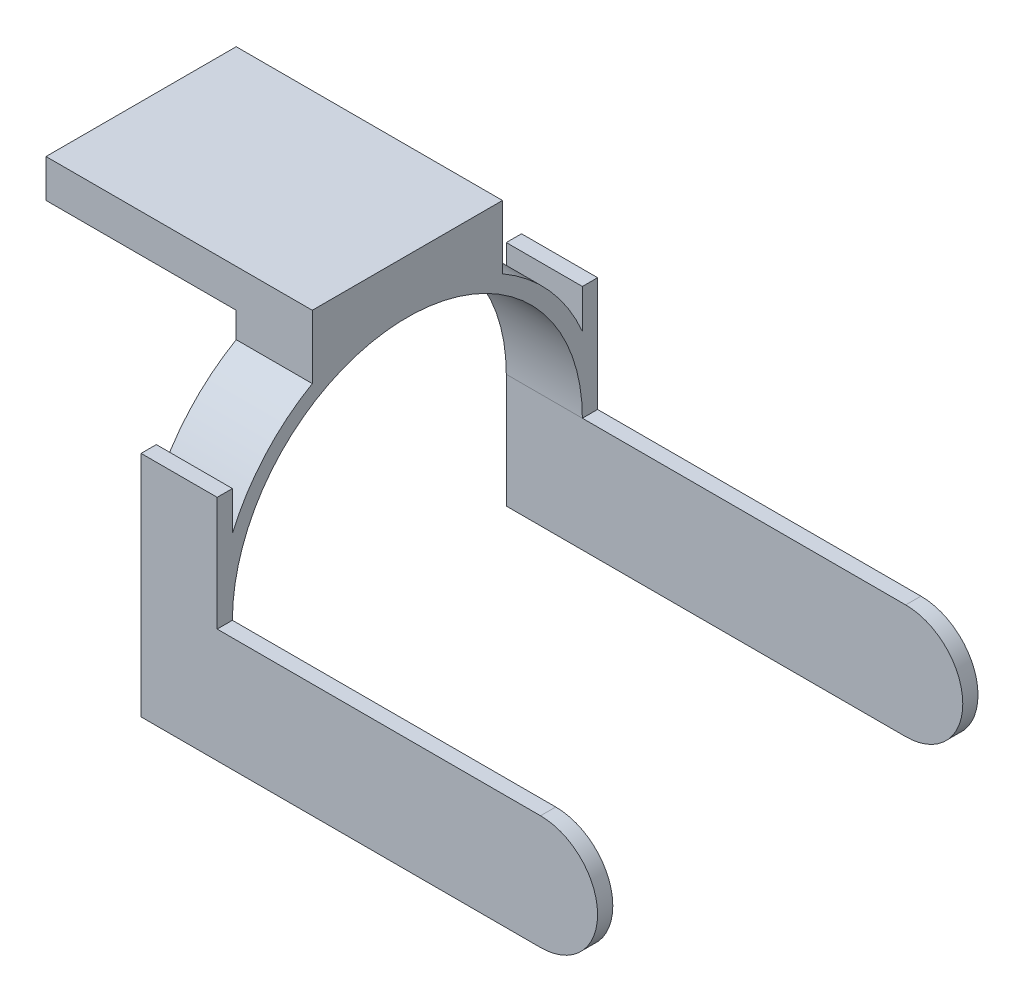
ISO-10303-21;
HEADER;
FILE_DESCRIPTION(('STEP AP214'),'2;1');
FILE_NAME('part.step','',(''),(''),'','','');
FILE_SCHEMA(('AUTOMOTIVE_DESIGN { 1 0 10303 214 1 1 1 1 }'));
ENDSEC;
DATA;
#1=APPLICATION_CONTEXT('core data for automotive mechanical design processes');
#2=APPLICATION_PROTOCOL_DEFINITION('international standard','automotive_design',2000,#1);
#3=PRODUCT_CONTEXT('',#1,'mechanical');
#4=PRODUCT('Part','Part','',(#3));
#5=PRODUCT_RELATED_PRODUCT_CATEGORY('part','',(#4));
#6=PRODUCT_DEFINITION_FORMATION('','',#4);
#7=PRODUCT_DEFINITION_CONTEXT('part definition',#1,'design');
#8=PRODUCT_DEFINITION('design','',#6,#7);
#9=PRODUCT_DEFINITION_SHAPE('','',#8);
#10=(LENGTH_UNIT() NAMED_UNIT(*) SI_UNIT(.MILLI.,.METRE.));
#11=(NAMED_UNIT(*) PLANE_ANGLE_UNIT() SI_UNIT($,.RADIAN.));
#12=(NAMED_UNIT(*) SI_UNIT($,.STERADIAN.) SOLID_ANGLE_UNIT());
#13=UNCERTAINTY_MEASURE_WITH_UNIT(LENGTH_MEASURE(1.E-05),#10,'distance_accuracy_value','');
#14=(GEOMETRIC_REPRESENTATION_CONTEXT(3) GLOBAL_UNCERTAINTY_ASSIGNED_CONTEXT((#13)) GLOBAL_UNIT_ASSIGNED_CONTEXT((#10,
#11,#12)) REPRESENTATION_CONTEXT('',''));
#15=CARTESIAN_POINT('',(0.,0.,0.));
#16=DIRECTION('',(0.,0.,1.));
#17=DIRECTION('',(1.,0.,0.));
#18=AXIS2_PLACEMENT_3D('',#15,#16,#17);
#19=CARTESIAN_POINT('',(0.,-55.0830621590042,0.));
#20=DIRECTION('',(1.,0.,0.));
#21=DIRECTION('',(0.,0.,-1.));
#22=AXIS2_PLACEMENT_3D('',#19,#20,#21);
#23=PLANE('',#22);
#24=DIRECTION('',(0.,0.,1.));
#25=VECTOR('',#24,1.);
#26=CARTESIAN_POINT('',(0.,-5.,-25.));
#27=LINE('',#26,#25);
#28=CARTESIAN_POINT('',(0.,-5.,-25.));
#29=VERTEX_POINT('',#28);
#30=CARTESIAN_POINT('',(0.,-5.,25.));
#31=VERTEX_POINT('',#30);
#32=EDGE_CURVE('E54',#29,#31,#27,.T.);
#33=ORIENTED_EDGE('',*,*,#32,.F.);
#34=DIRECTION('',(0.,1.,0.));
#35=VECTOR('',#34,1.);
#36=CARTESIAN_POINT('',(0.,5.,-25.));
#37=LINE('',#36,#35);
#38=CARTESIAN_POINT('',(0.,-11.6987772179597,-25.));
#39=VERTEX_POINT('',#38);
#40=EDGE_CURVE('E206',#39,#29,#37,.T.);
#41=ORIENTED_EDGE('',*,*,#40,.F.);
#42=CARTESIAN_POINT('',(0.,-55.0830621590042,0.));
#43=DIRECTION('',(1.,0.,0.));
#44=DIRECTION('',(0.,0.,-1.));
#45=AXIS2_PLACEMENT_3D('',#42,#43,#44);
#46=CIRCLE('',#45,50.0719100878501);
#47=CARTESIAN_POINT('',(0.,-35.304382227175,-46.));
#48=VERTEX_POINT('',#47);
#49=EDGE_CURVE('E298',#48,#39,#46,.T.);
#50=ORIENTED_EDGE('',*,*,#49,.F.);
#51=DIRECTION('',(0.,-1.,0.));
#52=VECTOR('',#51,1.);
#53=CARTESIAN_POINT('',(0.,-25.0830621590042,-46.));
#54=LINE('',#53,#52);
#55=CARTESIAN_POINT('',(0.,-25.0830621590042,-46.));
#56=VERTEX_POINT('',#55);
#57=EDGE_CURVE('E296',#56,#48,#54,.T.);
#58=ORIENTED_EDGE('',*,*,#57,.F.);
#59=DIRECTION('',(0.,0.,1.));
#60=VECTOR('',#59,1.);
#61=CARTESIAN_POINT('',(0.,-25.0830621590042,-46.));
#62=LINE('',#61,#60);
#63=CARTESIAN_POINT('',(0.,-25.0830621590042,-50.));
#64=VERTEX_POINT('',#63);
#65=EDGE_CURVE('E294',#64,#56,#62,.T.);
#66=ORIENTED_EDGE('',*,*,#65,.F.);
#67=DIRECTION('',(0.,1.,0.));
#68=VECTOR('',#67,1.);
#69=CARTESIAN_POINT('',(0.,-25.0830621590042,-50.));
#70=LINE('',#69,#68);
#71=CARTESIAN_POINT('',(0.,-85.0830621590042,-50.));
#72=VERTEX_POINT('',#71);
#73=EDGE_CURVE('E292',#72,#64,#70,.T.);
#74=ORIENTED_EDGE('',*,*,#73,.F.);
#75=DIRECTION('',(0.,0.,-1.));
#76=VECTOR('',#75,1.);
#77=CARTESIAN_POINT('',(0.,-85.0830621590043,-46.));
#78=LINE('',#77,#76);
#79=CARTESIAN_POINT('',(0.,-85.0830621590043,-46.));
#80=VERTEX_POINT('',#79);
#81=EDGE_CURVE('E289',#80,#72,#78,.T.);
#82=ORIENTED_EDGE('',*,*,#81,.F.);
#83=DIRECTION('',(0.,-1.,0.));
#84=VECTOR('',#83,1.);
#85=CARTESIAN_POINT('',(0.,-55.0830621590042,-46.));
#86=LINE('',#85,#84);
#87=CARTESIAN_POINT('',(0.,-55.0830621590042,-46.));
#88=VERTEX_POINT('',#87);
#89=EDGE_CURVE('E286',#88,#80,#86,.T.);
#90=ORIENTED_EDGE('',*,*,#89,.F.);
#91=CARTESIAN_POINT('',(0.,-55.0830621590042,0.));
#92=DIRECTION('',(-1.,0.,0.));
#93=DIRECTION('',(0.,0.,-1.));
#94=AXIS2_PLACEMENT_3D('',#91,#92,#93);
#95=CIRCLE('',#94,46.);
#96=CARTESIAN_POINT('',(0.,-55.0830621590042,46.));
#97=VERTEX_POINT('',#96);
#98=EDGE_CURVE('E284',#97,#88,#95,.T.);
#99=ORIENTED_EDGE('',*,*,#98,.F.);
#100=DIRECTION('',(0.,1.,0.));
#101=VECTOR('',#100,1.);
#102=CARTESIAN_POINT('',(0.,-55.0830621590042,46.));
#103=LINE('',#102,#101);
#104=CARTESIAN_POINT('',(0.,-85.0830621590042,46.));
#105=VERTEX_POINT('',#104);
#106=EDGE_CURVE('E282',#105,#97,#103,.T.);
#107=ORIENTED_EDGE('',*,*,#106,.F.);
#108=DIRECTION('',(0.,0.,-1.));
#109=VECTOR('',#108,1.);
#110=CARTESIAN_POINT('',(0.,-85.0830621590042,50.));
#111=LINE('',#110,#109);
#112=CARTESIAN_POINT('',(0.,-85.0830621590042,50.));
#113=VERTEX_POINT('',#112);
#114=EDGE_CURVE('E279',#113,#105,#111,.T.);
#115=ORIENTED_EDGE('',*,*,#114,.F.);
#116=DIRECTION('',(0.,-1.,0.));
#117=VECTOR('',#116,1.);
#118=CARTESIAN_POINT('',(0.,-25.0830621590042,50.));
#119=LINE('',#118,#117);
#120=CARTESIAN_POINT('',(0.,-25.0830621590042,50.));
#121=VERTEX_POINT('',#120);
#122=EDGE_CURVE('E276',#121,#113,#119,.T.);
#123=ORIENTED_EDGE('',*,*,#122,.F.);
#124=DIRECTION('',(0.,0.,1.));
#125=VECTOR('',#124,1.);
#126=CARTESIAN_POINT('',(0.,-25.0830621590042,50.));
#127=LINE('',#126,#125);
#128=CARTESIAN_POINT('',(0.,-25.0830621590042,46.));
#129=VERTEX_POINT('',#128);
#130=EDGE_CURVE('E274',#129,#121,#127,.T.);
#131=ORIENTED_EDGE('',*,*,#130,.F.);
#132=DIRECTION('',(0.,1.,0.));
#133=VECTOR('',#132,1.);
#134=CARTESIAN_POINT('',(0.,-25.0830621590042,46.));
#135=LINE('',#134,#133);
#136=CARTESIAN_POINT('',(0.,-35.304382227175,46.));
#137=VERTEX_POINT('',#136);
#138=EDGE_CURVE('E272',#137,#129,#135,.T.);
#139=ORIENTED_EDGE('',*,*,#138,.F.);
#140=CARTESIAN_POINT('',(0.,-55.0830621590042,0.));
#141=DIRECTION('',(1.,0.,0.));
#142=DIRECTION('',(0.,0.,-1.));
#143=AXIS2_PLACEMENT_3D('',#140,#141,#142);
#144=CIRCLE('',#143,50.0719100878501);
#145=CARTESIAN_POINT('',(0.,-11.6987772179597,25.));
#146=VERTEX_POINT('',#145);
#147=EDGE_CURVE('E270',#146,#137,#144,.T.);
#148=ORIENTED_EDGE('',*,*,#147,.F.);
#149=DIRECTION('',(0.,-1.,0.));
#150=VECTOR('',#149,1.);
#151=CARTESIAN_POINT('',(0.,-5.,25.));
#152=LINE('',#151,#150);
#153=EDGE_CURVE('E241',#31,#146,#152,.T.);
#154=ORIENTED_EDGE('',*,*,#153,.F.);
#155=EDGE_LOOP('',(#33,#41,#50,#58,#66,#74,#82,#90,#99,#107,#115,#123,#131,#139,#148,#154));
#156=FACE_BOUND('',#155,.T.);
#157=ADVANCED_FACE('F39',(#156),#23,.F.);
#158=CARTESIAN_POINT('',(20.,-85.0830621590042,50.));
#159=DIRECTION('',(0.,1.,0.));
#160=DIRECTION('',(0.,0.,1.));
#161=AXIS2_PLACEMENT_3D('',#158,#159,#160);
#162=PLANE('',#161);
#163=DIRECTION('',(0.,0.,1.));
#164=VECTOR('',#163,1.);
#165=CARTESIAN_POINT('',(105.,-85.0830621590042,-50.));
#166=LINE('',#165,#164);
#167=CARTESIAN_POINT('',(105.,-85.0830621590042,46.));
#168=VERTEX_POINT('',#167);
#169=CARTESIAN_POINT('',(105.,-85.0830621590042,50.));
#170=VERTEX_POINT('',#169);
#171=EDGE_CURVE('E215',#168,#170,#166,.T.);
#172=ORIENTED_EDGE('',*,*,#171,.T.);
#173=DIRECTION('',(-1.,0.,0.));
#174=VECTOR('',#173,1.);
#175=CARTESIAN_POINT('',(20.,-85.0830621590042,50.));
#176=LINE('',#175,#174);
#177=EDGE_CURVE('E328',#170,#113,#176,.T.);
#178=ORIENTED_EDGE('',*,*,#177,.T.);
#179=ORIENTED_EDGE('',*,*,#114,.T.);
#180=DIRECTION('',(-1.,0.,0.));
#181=VECTOR('',#180,1.);
#182=CARTESIAN_POINT('',(20.,-85.0830621590042,46.));
#183=LINE('',#182,#181);
#184=EDGE_CURVE('E326',#168,#105,#183,.T.);
#185=ORIENTED_EDGE('',*,*,#184,.F.);
#186=EDGE_LOOP('',(#172,#178,#179,#185));
#187=FACE_BOUND('',#186,.T.);
#188=ADVANCED_FACE('F413',(#187),#162,.F.);
#189=CARTESIAN_POINT('',(20.,-85.0830621590043,-46.));
#190=DIRECTION('',(0.,1.,0.));
#191=DIRECTION('',(0.,0.,1.));
#192=AXIS2_PLACEMENT_3D('',#189,#190,#191);
#193=PLANE('',#192);
#194=CARTESIAN_POINT('',(105.,-85.0830621590042,-50.));
#195=VERTEX_POINT('',#194);
#196=CARTESIAN_POINT('',(105.,-85.0830621590042,-46.));
#197=VERTEX_POINT('',#196);
#198=EDGE_CURVE('E222',#195,#197,#166,.T.);
#199=ORIENTED_EDGE('',*,*,#198,.T.);
#200=DIRECTION('',(-1.,0.,0.));
#201=VECTOR('',#200,1.);
#202=CARTESIAN_POINT('',(20.,-85.0830621590043,-46.));
#203=LINE('',#202,#201);
#204=EDGE_CURVE('E318',#197,#80,#203,.T.);
#205=ORIENTED_EDGE('',*,*,#204,.T.);
#206=ORIENTED_EDGE('',*,*,#81,.T.);
#207=DIRECTION('',(-1.,0.,0.));
#208=VECTOR('',#207,1.);
#209=CARTESIAN_POINT('',(20.,-85.0830621590042,-50.));
#210=LINE('',#209,#208);
#211=EDGE_CURVE('E316',#195,#72,#210,.T.);
#212=ORIENTED_EDGE('',*,*,#211,.F.);
#213=EDGE_LOOP('',(#199,#205,#206,#212));
#214=FACE_BOUND('',#213,.T.);
#215=ADVANCED_FACE('F420',(#214),#193,.F.);
#216=CARTESIAN_POINT('',(20.,-55.0830621590042,0.));
#217=DIRECTION('',(1.,0.,0.));
#218=DIRECTION('',(0.,0.,-1.));
#219=AXIS2_PLACEMENT_3D('',#216,#217,#218);
#220=PLANE('',#219);
#221=CARTESIAN_POINT('',(20.,-55.0830621590042,0.));
#222=DIRECTION('',(-1.,0.,0.));
#223=DIRECTION('',(0.,0.,-1.));
#224=AXIS2_PLACEMENT_3D('',#221,#222,#223);
#225=CIRCLE('',#224,46.);
#226=CARTESIAN_POINT('',(20.,-55.0830621590042,46.));
#227=VERTEX_POINT('',#226);
#228=CARTESIAN_POINT('',(20.,-55.0830621590042,-46.));
#229=VERTEX_POINT('',#228);
#230=EDGE_CURVE('E253',#227,#229,#225,.T.);
#231=ORIENTED_EDGE('',*,*,#230,.T.);
#232=DIRECTION('',(0.,0.,1.));
#233=VECTOR('',#232,1.);
#234=CARTESIAN_POINT('',(20.,-55.0830621590042,-46.));
#235=LINE('',#234,#233);
#236=CARTESIAN_POINT('',(20.,-55.0830621590042,-50.));
#237=VERTEX_POINT('',#236);
#238=EDGE_CURVE('E227',#237,#229,#235,.T.);
#239=ORIENTED_EDGE('',*,*,#238,.F.);
#240=DIRECTION('',(0.,1.,0.));
#241=VECTOR('',#240,1.);
#242=CARTESIAN_POINT('',(20.,-25.0830621590042,-50.));
#243=LINE('',#242,#241);
#244=CARTESIAN_POINT('',(20.,-25.0830621590042,-50.));
#245=VERTEX_POINT('',#244);
#246=EDGE_CURVE('E256',#237,#245,#243,.T.);
#247=ORIENTED_EDGE('',*,*,#246,.T.);
#248=DIRECTION('',(0.,0.,1.));
#249=VECTOR('',#248,1.);
#250=CARTESIAN_POINT('',(20.,-25.0830621590042,-46.));
#251=LINE('',#250,#249);
#252=CARTESIAN_POINT('',(20.,-25.0830621590042,-46.));
#253=VERTEX_POINT('',#252);
#254=EDGE_CURVE('E258',#245,#253,#251,.T.);
#255=ORIENTED_EDGE('',*,*,#254,.T.);
#256=DIRECTION('',(0.,-1.,0.));
#257=VECTOR('',#256,1.);
#258=CARTESIAN_POINT('',(20.,-25.0830621590042,-46.));
#259=LINE('',#258,#257);
#260=CARTESIAN_POINT('',(20.,-35.304382227175,-46.));
#261=VERTEX_POINT('',#260);
#262=EDGE_CURVE('E260',#253,#261,#259,.T.);
#263=ORIENTED_EDGE('',*,*,#262,.T.);
#264=CARTESIAN_POINT('',(20.,-55.0830621590042,0.));
#265=DIRECTION('',(1.,0.,0.));
#266=DIRECTION('',(0.,0.,-1.));
#267=AXIS2_PLACEMENT_3D('',#264,#265,#266);
#268=CIRCLE('',#267,50.0719100878501);
#269=CARTESIAN_POINT('',(20.,-11.6987772179597,-25.));
#270=VERTEX_POINT('',#269);
#271=EDGE_CURVE('E262',#261,#270,#268,.T.);
#272=ORIENTED_EDGE('',*,*,#271,.T.);
#273=DIRECTION('',(0.,1.,0.));
#274=VECTOR('',#273,1.);
#275=CARTESIAN_POINT('',(20.,-5.,-25.));
#276=LINE('',#275,#274);
#277=CARTESIAN_POINT('',(20.,5.,-25.));
#278=VERTEX_POINT('',#277);
#279=EDGE_CURVE('E264',#270,#278,#276,.T.);
#280=ORIENTED_EDGE('',*,*,#279,.T.);
#281=DIRECTION('',(0.,0.,1.));
#282=VECTOR('',#281,1.);
#283=CARTESIAN_POINT('',(20.,5.,25.));
#284=LINE('',#283,#282);
#285=CARTESIAN_POINT('',(20.,5.,25.));
#286=VERTEX_POINT('',#285);
#287=EDGE_CURVE('E266',#278,#286,#284,.T.);
#288=ORIENTED_EDGE('',*,*,#287,.T.);
#289=DIRECTION('',(0.,-1.,0.));
#290=VECTOR('',#289,1.);
#291=CARTESIAN_POINT('',(20.,5.,25.));
#292=LINE('',#291,#290);
#293=CARTESIAN_POINT('',(20.,-11.6987772179597,25.));
#294=VERTEX_POINT('',#293);
#295=EDGE_CURVE('E242',#286,#294,#292,.T.);
#296=ORIENTED_EDGE('',*,*,#295,.T.);
#297=CARTESIAN_POINT('',(20.,-55.0830621590042,0.));
#298=DIRECTION('',(1.,0.,0.));
#299=DIRECTION('',(0.,0.,-1.));
#300=AXIS2_PLACEMENT_3D('',#297,#298,#299);
#301=CIRCLE('',#300,50.0719100878501);
#302=CARTESIAN_POINT('',(20.,-35.304382227175,46.));
#303=VERTEX_POINT('',#302);
#304=EDGE_CURVE('E244',#294,#303,#301,.T.);
#305=ORIENTED_EDGE('',*,*,#304,.T.);
#306=DIRECTION('',(0.,1.,0.));
#307=VECTOR('',#306,1.);
#308=CARTESIAN_POINT('',(20.,-25.0830621590042,46.));
#309=LINE('',#308,#307);
#310=CARTESIAN_POINT('',(20.,-25.0830621590042,46.));
#311=VERTEX_POINT('',#310);
#312=EDGE_CURVE('E246',#303,#311,#309,.T.);
#313=ORIENTED_EDGE('',*,*,#312,.T.);
#314=DIRECTION('',(0.,0.,1.));
#315=VECTOR('',#314,1.);
#316=CARTESIAN_POINT('',(20.,-25.0830621590042,50.));
#317=LINE('',#316,#315);
#318=CARTESIAN_POINT('',(20.,-25.0830621590042,50.));
#319=VERTEX_POINT('',#318);
#320=EDGE_CURVE('E248',#311,#319,#317,.T.);
#321=ORIENTED_EDGE('',*,*,#320,.T.);
#322=DIRECTION('',(0.,-1.,0.));
#323=VECTOR('',#322,1.);
#324=CARTESIAN_POINT('',(20.,-25.0830621590042,50.));
#325=LINE('',#324,#323);
#326=CARTESIAN_POINT('',(20.,-55.0830621590042,50.));
#327=VERTEX_POINT('',#326);
#328=EDGE_CURVE('E250',#319,#327,#325,.T.);
#329=ORIENTED_EDGE('',*,*,#328,.T.);
#330=DIRECTION('',(0.,0.,1.));
#331=VECTOR('',#330,1.);
#332=CARTESIAN_POINT('',(20.,-55.0830621590042,50.));
#333=LINE('',#332,#331);
#334=EDGE_CURVE('E234',#227,#327,#333,.T.);
#335=ORIENTED_EDGE('',*,*,#334,.F.);
#336=EDGE_LOOP('',(#231,#239,#247,#255,#263,#272,#280,#288,#296,#305,#313,#321,#329,#335));
#337=FACE_BOUND('',#336,.T.);
#338=ADVANCED_FACE('F359',(#337),#220,.T.);
#339=CARTESIAN_POINT('',(20.,-5.,25.));
#340=DIRECTION('',(0.,0.,-1.));
#341=DIRECTION('',(-1.,0.,0.));
#342=AXIS2_PLACEMENT_3D('',#339,#340,#341);
#343=PLANE('',#342);
#344=DIRECTION('',(-1.,0.,0.));
#345=VECTOR('',#344,1.);
#346=CARTESIAN_POINT('',(20.,5.,25.));
#347=LINE('',#346,#345);
#348=CARTESIAN_POINT('',(-50.,5.,25.));
#349=VERTEX_POINT('',#348);
#350=EDGE_CURVE('E268',#286,#349,#347,.T.);
#351=ORIENTED_EDGE('',*,*,#350,.T.);
#352=DIRECTION('',(0.,1.,0.));
#353=VECTOR('',#352,1.);
#354=CARTESIAN_POINT('',(-50.,5.,25.));
#355=LINE('',#354,#353);
#356=CARTESIAN_POINT('',(-50.,-5.,25.));
#357=VERTEX_POINT('',#356);
#358=EDGE_CURVE('E193',#357,#349,#355,.T.);
#359=ORIENTED_EDGE('',*,*,#358,.F.);
#360=DIRECTION('',(1.,0.,0.));
#361=VECTOR('',#360,1.);
#362=CARTESIAN_POINT('',(-50.,-5.,25.));
#363=LINE('',#362,#361);
#364=EDGE_CURVE('E189',#357,#31,#363,.T.);
#365=ORIENTED_EDGE('',*,*,#364,.T.);
#366=ORIENTED_EDGE('',*,*,#153,.T.);
#367=DIRECTION('',(-1.,0.,0.));
#368=VECTOR('',#367,1.);
#369=CARTESIAN_POINT('',(20.,-11.6987772179597,25.));
#370=LINE('',#369,#368);
#371=EDGE_CURVE('E11',#294,#146,#370,.T.);
#372=ORIENTED_EDGE('',*,*,#371,.F.);
#373=ORIENTED_EDGE('',*,*,#295,.F.);
#374=EDGE_LOOP('',(#351,#359,#365,#366,#372,#373));
#375=FACE_BOUND('',#374,.T.);
#376=ADVANCED_FACE('F41',(#375),#343,.F.);
#377=CARTESIAN_POINT('',(20.,-55.0830621590042,0.));
#378=DIRECTION('',(-1.,0.,0.));
#379=DIRECTION('',(0.,0.,1.));
#380=AXIS2_PLACEMENT_3D('',#377,#378,#379);
#381=CYLINDRICAL_SURFACE('',#380,50.0719100878501);
#382=ORIENTED_EDGE('',*,*,#147,.T.);
#383=DIRECTION('',(-1.,0.,0.));
#384=VECTOR('',#383,1.);
#385=CARTESIAN_POINT('',(20.,-35.304382227175,46.));
#386=LINE('',#385,#384);
#387=EDGE_CURVE('E47',#303,#137,#386,.T.);
#388=ORIENTED_EDGE('',*,*,#387,.F.);
#389=ORIENTED_EDGE('',*,*,#304,.F.);
#390=ORIENTED_EDGE('',*,*,#371,.T.);
#391=EDGE_LOOP('',(#382,#388,#389,#390));
#392=FACE_BOUND('',#391,.T.);
#393=ADVANCED_FACE('F404',(#392),#381,.T.);
#394=CARTESIAN_POINT('',(20.,-25.0830621590042,46.));
#395=DIRECTION('',(0.,0.,1.));
#396=DIRECTION('',(1.,0.,0.));
#397=AXIS2_PLACEMENT_3D('',#394,#395,#396);
#398=PLANE('',#397);
#399=ORIENTED_EDGE('',*,*,#138,.T.);
#400=DIRECTION('',(-1.,0.,0.));
#401=VECTOR('',#400,1.);
#402=CARTESIAN_POINT('',(20.,-25.0830621590042,46.));
#403=LINE('',#402,#401);
#404=EDGE_CURVE('E333',#311,#129,#403,.T.);
#405=ORIENTED_EDGE('',*,*,#404,.F.);
#406=ORIENTED_EDGE('',*,*,#312,.F.);
#407=ORIENTED_EDGE('',*,*,#387,.T.);
#408=EDGE_LOOP('',(#399,#405,#406,#407));
#409=FACE_BOUND('',#408,.T.);
#410=ADVANCED_FACE('F340',(#409),#398,.F.);
#411=CARTESIAN_POINT('',(20.,-25.0830621590042,50.));
#412=DIRECTION('',(0.,-1.,0.));
#413=DIRECTION('',(0.,0.,-1.));
#414=AXIS2_PLACEMENT_3D('',#411,#412,#413);
#415=PLANE('',#414);
#416=ORIENTED_EDGE('',*,*,#130,.T.);
#417=DIRECTION('',(-1.,0.,0.));
#418=VECTOR('',#417,1.);
#419=CARTESIAN_POINT('',(20.,-25.0830621590042,50.));
#420=LINE('',#419,#418);
#421=EDGE_CURVE('E330',#319,#121,#420,.T.);
#422=ORIENTED_EDGE('',*,*,#421,.F.);
#423=ORIENTED_EDGE('',*,*,#320,.F.);
#424=ORIENTED_EDGE('',*,*,#404,.T.);
#425=EDGE_LOOP('',(#416,#422,#423,#424));
#426=FACE_BOUND('',#425,.T.);
#427=ADVANCED_FACE('F350',(#426),#415,.F.);
#428=CARTESIAN_POINT('',(20.,-25.0830621590042,50.));
#429=DIRECTION('',(0.,0.,-1.));
#430=DIRECTION('',(0.,1.,0.));
#431=AXIS2_PLACEMENT_3D('',#428,#429,#430);
#432=PLANE('',#431);
#433=ORIENTED_EDGE('',*,*,#177,.F.);
#434=CARTESIAN_POINT('',(105.,-70.0830621590042,50.));
#435=DIRECTION('',(0.,0.,-1.));
#436=DIRECTION('',(1.,0.,0.));
#437=AXIS2_PLACEMENT_3D('',#434,#435,#436);
#438=CIRCLE('',#437,15.);
#439=CARTESIAN_POINT('',(105.,-55.0830621590042,50.));
#440=VERTEX_POINT('',#439);
#441=EDGE_CURVE('E207',#440,#170,#438,.T.);
#442=ORIENTED_EDGE('',*,*,#441,.F.);
#443=DIRECTION('',(-1.,0.,0.));
#444=VECTOR('',#443,1.);
#445=CARTESIAN_POINT('',(120.,-55.0830621590042,50.));
#446=LINE('',#445,#444);
#447=EDGE_CURVE('E237',#440,#327,#446,.T.);
#448=ORIENTED_EDGE('',*,*,#447,.T.);
#449=ORIENTED_EDGE('',*,*,#328,.F.);
#450=ORIENTED_EDGE('',*,*,#421,.T.);
#451=ORIENTED_EDGE('',*,*,#122,.T.);
#452=EDGE_LOOP('',(#433,#442,#448,#449,#450,#451));
#453=FACE_BOUND('',#452,.T.);
#454=ADVANCED_FACE('F355',(#453),#432,.F.);
#455=CARTESIAN_POINT('',(20.,-55.0830621590042,46.));
#456=DIRECTION('',(0.,0.,1.));
#457=DIRECTION('',(0.,-1.,0.));
#458=AXIS2_PLACEMENT_3D('',#455,#456,#457);
#459=PLANE('',#458);
#460=DIRECTION('',(-1.,0.,0.));
#461=VECTOR('',#460,1.);
#462=CARTESIAN_POINT('',(120.,-55.0830621590042,46.));
#463=LINE('',#462,#461);
#464=CARTESIAN_POINT('',(105.,-55.0830621590042,46.));
#465=VERTEX_POINT('',#464);
#466=EDGE_CURVE('E239',#465,#227,#463,.T.);
#467=ORIENTED_EDGE('',*,*,#466,.F.);
#468=CARTESIAN_POINT('',(105.,-70.0830621590042,46.));
#469=DIRECTION('',(0.,0.,1.));
#470=DIRECTION('',(0.,-1.,0.));
#471=AXIS2_PLACEMENT_3D('',#468,#469,#470);
#472=CIRCLE('',#471,15.);
#473=EDGE_CURVE('E62',#465,#168,#472,.F.);
#474=ORIENTED_EDGE('',*,*,#473,.T.);
#475=ORIENTED_EDGE('',*,*,#184,.T.);
#476=ORIENTED_EDGE('',*,*,#106,.T.);
#477=DIRECTION('',(-1.,0.,0.));
#478=VECTOR('',#477,1.);
#479=CARTESIAN_POINT('',(20.,-55.0830621590042,46.));
#480=LINE('',#479,#478);
#481=EDGE_CURVE('E323',#227,#97,#480,.T.);
#482=ORIENTED_EDGE('',*,*,#481,.F.);
#483=EDGE_LOOP('',(#467,#474,#475,#476,#482));
#484=FACE_BOUND('',#483,.T.);
#485=ADVANCED_FACE('F365',(#484),#459,.F.);
#486=CARTESIAN_POINT('',(20.,-55.0830621590042,0.));
#487=DIRECTION('',(-1.,0.,0.));
#488=DIRECTION('',(0.,0.,1.));
#489=AXIS2_PLACEMENT_3D('',#486,#487,#488);
#490=CYLINDRICAL_SURFACE('',#489,46.);
#491=ORIENTED_EDGE('',*,*,#98,.T.);
#492=DIRECTION('',(-1.,0.,0.));
#493=VECTOR('',#492,1.);
#494=CARTESIAN_POINT('',(20.,-55.0830621590042,-46.));
#495=LINE('',#494,#493);
#496=EDGE_CURVE('E320',#229,#88,#495,.T.);
#497=ORIENTED_EDGE('',*,*,#496,.F.);
#498=ORIENTED_EDGE('',*,*,#230,.F.);
#499=ORIENTED_EDGE('',*,*,#481,.T.);
#500=EDGE_LOOP('',(#491,#497,#498,#499));
#501=FACE_BOUND('',#500,.T.);
#502=ADVANCED_FACE('F371',(#501),#490,.F.);
#503=CARTESIAN_POINT('',(20.,-55.0830621590042,-46.));
#504=DIRECTION('',(0.,0.,-1.));
#505=DIRECTION('',(0.,1.,0.));
#506=AXIS2_PLACEMENT_3D('',#503,#504,#505);
#507=PLANE('',#506);
#508=ORIENTED_EDGE('',*,*,#204,.F.);
#509=CARTESIAN_POINT('',(105.,-70.0830621590042,-46.));
#510=DIRECTION('',(0.,0.,-1.));
#511=DIRECTION('',(0.,1.,0.));
#512=AXIS2_PLACEMENT_3D('',#509,#510,#511);
#513=CIRCLE('',#512,15.);
#514=CARTESIAN_POINT('',(105.,-55.0830621590042,-46.));
#515=VERTEX_POINT('',#514);
#516=EDGE_CURVE('E220',#197,#515,#513,.F.);
#517=ORIENTED_EDGE('',*,*,#516,.T.);
#518=DIRECTION('',(-1.,0.,0.));
#519=VECTOR('',#518,1.);
#520=CARTESIAN_POINT('',(120.,-55.0830621590042,-46.));
#521=LINE('',#520,#519);
#522=EDGE_CURVE('E230',#515,#229,#521,.T.);
#523=ORIENTED_EDGE('',*,*,#522,.T.);
#524=ORIENTED_EDGE('',*,*,#496,.T.);
#525=ORIENTED_EDGE('',*,*,#89,.T.);
#526=EDGE_LOOP('',(#508,#517,#523,#524,#525));
#527=FACE_BOUND('',#526,.T.);
#528=ADVANCED_FACE('F438',(#527),#507,.F.);
#529=CARTESIAN_POINT('',(20.,-25.0830621590042,-50.));
#530=DIRECTION('',(0.,0.,1.));
#531=DIRECTION('',(0.,-1.,0.));
#532=AXIS2_PLACEMENT_3D('',#529,#530,#531);
#533=PLANE('',#532);
#534=DIRECTION('',(-1.,0.,0.));
#535=VECTOR('',#534,1.);
#536=CARTESIAN_POINT('',(120.,-55.0830621590042,-50.));
#537=LINE('',#536,#535);
#538=CARTESIAN_POINT('',(105.,-55.0830621590042,-50.));
#539=VERTEX_POINT('',#538);
#540=EDGE_CURVE('E232',#539,#237,#537,.T.);
#541=ORIENTED_EDGE('',*,*,#540,.F.);
#542=CARTESIAN_POINT('',(105.,-70.0830621590042,-50.));
#543=DIRECTION('',(0.,0.,-1.));
#544=DIRECTION('',(1.,0.,0.));
#545=AXIS2_PLACEMENT_3D('',#542,#543,#544);
#546=CIRCLE('',#545,15.);
#547=EDGE_CURVE('E209',#539,#195,#546,.T.);
#548=ORIENTED_EDGE('',*,*,#547,.T.);
#549=ORIENTED_EDGE('',*,*,#211,.T.);
#550=ORIENTED_EDGE('',*,*,#73,.T.);
#551=DIRECTION('',(-1.,0.,0.));
#552=VECTOR('',#551,1.);
#553=CARTESIAN_POINT('',(20.,-25.0830621590042,-50.));
#554=LINE('',#553,#552);
#555=EDGE_CURVE('E313',#245,#64,#554,.T.);
#556=ORIENTED_EDGE('',*,*,#555,.F.);
#557=ORIENTED_EDGE('',*,*,#246,.F.);
#558=EDGE_LOOP('',(#541,#548,#549,#550,#556,#557));
#559=FACE_BOUND('',#558,.T.);
#560=ADVANCED_FACE('F379',(#559),#533,.F.);
#561=CARTESIAN_POINT('',(20.,-25.0830621590042,-46.));
#562=DIRECTION('',(0.,-1.,0.));
#563=DIRECTION('',(0.,0.,-1.));
#564=AXIS2_PLACEMENT_3D('',#561,#562,#563);
#565=PLANE('',#564);
#566=ORIENTED_EDGE('',*,*,#65,.T.);
#567=DIRECTION('',(-1.,0.,0.));
#568=VECTOR('',#567,1.);
#569=CARTESIAN_POINT('',(20.,-25.0830621590042,-46.));
#570=LINE('',#569,#568);
#571=EDGE_CURVE('E310',#253,#56,#570,.T.);
#572=ORIENTED_EDGE('',*,*,#571,.F.);
#573=ORIENTED_EDGE('',*,*,#254,.F.);
#574=ORIENTED_EDGE('',*,*,#555,.T.);
#575=EDGE_LOOP('',(#566,#572,#573,#574));
#576=FACE_BOUND('',#575,.T.);
#577=ADVANCED_FACE('F385',(#576),#565,.F.);
#578=CARTESIAN_POINT('',(20.,-25.0830621590042,-46.));
#579=DIRECTION('',(0.,0.,-1.));
#580=DIRECTION('',(-1.,0.,0.));
#581=AXIS2_PLACEMENT_3D('',#578,#579,#580);
#582=PLANE('',#581);
#583=ORIENTED_EDGE('',*,*,#57,.T.);
#584=DIRECTION('',(-1.,0.,0.));
#585=VECTOR('',#584,1.);
#586=CARTESIAN_POINT('',(20.,-35.304382227175,-46.));
#587=LINE('',#586,#585);
#588=EDGE_CURVE('E307',#261,#48,#587,.T.);
#589=ORIENTED_EDGE('',*,*,#588,.F.);
#590=ORIENTED_EDGE('',*,*,#262,.F.);
#591=ORIENTED_EDGE('',*,*,#571,.T.);
#592=EDGE_LOOP('',(#583,#589,#590,#591));
#593=FACE_BOUND('',#592,.T.);
#594=ADVANCED_FACE('F391',(#593),#582,.F.);
#595=CARTESIAN_POINT('',(20.,-55.0830621590042,0.));
#596=DIRECTION('',(-1.,0.,0.));
#597=DIRECTION('',(0.,0.,1.));
#598=AXIS2_PLACEMENT_3D('',#595,#596,#597);
#599=CYLINDRICAL_SURFACE('',#598,50.0719100878501);
#600=ORIENTED_EDGE('',*,*,#49,.T.);
#601=DIRECTION('',(-1.,0.,0.));
#602=VECTOR('',#601,1.);
#603=CARTESIAN_POINT('',(20.,-11.6987772179597,-25.));
#604=LINE('',#603,#602);
#605=EDGE_CURVE('E305',#270,#39,#604,.T.);
#606=ORIENTED_EDGE('',*,*,#605,.F.);
#607=ORIENTED_EDGE('',*,*,#271,.F.);
#608=ORIENTED_EDGE('',*,*,#588,.T.);
#609=EDGE_LOOP('',(#600,#606,#607,#608));
#610=FACE_BOUND('',#609,.T.);
#611=ADVANCED_FACE('F395',(#610),#599,.T.);
#612=CARTESIAN_POINT('',(20.,5.,-25.));
#613=DIRECTION('',(0.,0.,1.));
#614=DIRECTION('',(1.,0.,0.));
#615=AXIS2_PLACEMENT_3D('',#612,#613,#614);
#616=PLANE('',#615);
#617=ORIENTED_EDGE('',*,*,#40,.T.);
#618=DIRECTION('',(1.,0.,0.));
#619=VECTOR('',#618,1.);
#620=CARTESIAN_POINT('',(-50.,-5.,-25.));
#621=LINE('',#620,#619);
#622=CARTESIAN_POINT('',(-50.,-5.,-25.));
#623=VERTEX_POINT('',#622);
#624=EDGE_CURVE('E187',#623,#29,#621,.T.);
#625=ORIENTED_EDGE('',*,*,#624,.F.);
#626=DIRECTION('',(0.,-1.,0.));
#627=VECTOR('',#626,1.);
#628=CARTESIAN_POINT('',(-50.,5.,-25.));
#629=LINE('',#628,#627);
#630=CARTESIAN_POINT('',(-50.,5.,-25.));
#631=VERTEX_POINT('',#630);
#632=EDGE_CURVE('E194',#631,#623,#629,.T.);
#633=ORIENTED_EDGE('',*,*,#632,.F.);
#634=DIRECTION('',(-1.,0.,0.));
#635=VECTOR('',#634,1.);
#636=CARTESIAN_POINT('',(20.,5.,-25.));
#637=LINE('',#636,#635);
#638=EDGE_CURVE('E303',#278,#631,#637,.T.);
#639=ORIENTED_EDGE('',*,*,#638,.F.);
#640=ORIENTED_EDGE('',*,*,#279,.F.);
#641=ORIENTED_EDGE('',*,*,#605,.T.);
#642=EDGE_LOOP('',(#617,#625,#633,#639,#640,#641));
#643=FACE_BOUND('',#642,.T.);
#644=ADVANCED_FACE('F204',(#643),#616,.F.);
#645=CARTESIAN_POINT('',(20.,5.,25.));
#646=DIRECTION('',(0.,-1.,0.));
#647=DIRECTION('',(0.,0.,-1.));
#648=AXIS2_PLACEMENT_3D('',#645,#646,#647);
#649=PLANE('',#648);
#650=ORIENTED_EDGE('',*,*,#638,.T.);
#651=DIRECTION('',(0.,0.,-1.));
#652=VECTOR('',#651,1.);
#653=CARTESIAN_POINT('',(-50.,5.,-25.));
#654=LINE('',#653,#652);
#655=EDGE_CURVE('E200',#349,#631,#654,.T.);
#656=ORIENTED_EDGE('',*,*,#655,.F.);
#657=ORIENTED_EDGE('',*,*,#350,.F.);
#658=ORIENTED_EDGE('',*,*,#287,.F.);
#659=EDGE_LOOP('',(#650,#656,#657,#658));
#660=FACE_BOUND('',#659,.T.);
#661=ADVANCED_FACE('F402',(#660),#649,.F.);
#662=CARTESIAN_POINT('',(120.,-55.0830621590042,50.));
#663=DIRECTION('',(0.,-1.,0.));
#664=DIRECTION('',(0.,0.,-1.));
#665=AXIS2_PLACEMENT_3D('',#662,#663,#664);
#666=PLANE('',#665);
#667=ORIENTED_EDGE('',*,*,#447,.F.);
#668=DIRECTION('',(0.,0.,1.));
#669=VECTOR('',#668,1.);
#670=CARTESIAN_POINT('',(105.,-55.0830621590042,-50.));
#671=LINE('',#670,#669);
#672=EDGE_CURVE('E221',#465,#440,#671,.T.);
#673=ORIENTED_EDGE('',*,*,#672,.F.);
#674=ORIENTED_EDGE('',*,*,#466,.T.);
#675=ORIENTED_EDGE('',*,*,#334,.T.);
#676=EDGE_LOOP('',(#667,#673,#674,#675));
#677=FACE_BOUND('',#676,.T.);
#678=ADVANCED_FACE('F362',(#677),#666,.F.);
#679=CARTESIAN_POINT('',(120.,-55.0830621590042,-46.));
#680=DIRECTION('',(0.,-1.,0.));
#681=DIRECTION('',(0.,0.,-1.));
#682=AXIS2_PLACEMENT_3D('',#679,#680,#681);
#683=PLANE('',#682);
#684=ORIENTED_EDGE('',*,*,#522,.F.);
#685=EDGE_CURVE('E217',#539,#515,#671,.T.);
#686=ORIENTED_EDGE('',*,*,#685,.F.);
#687=ORIENTED_EDGE('',*,*,#540,.T.);
#688=ORIENTED_EDGE('',*,*,#238,.T.);
#689=EDGE_LOOP('',(#684,#686,#687,#688));
#690=FACE_BOUND('',#689,.T.);
#691=ADVANCED_FACE('F497',(#690),#683,.F.);
#692=CARTESIAN_POINT('',(105.,-70.0830621590042,-50.));
#693=DIRECTION('',(0.,0.,1.));
#694=DIRECTION('',(1.,0.,0.));
#695=AXIS2_PLACEMENT_3D('',#692,#693,#694);
#696=CYLINDRICAL_SURFACE('',#695,15.);
#697=ORIENTED_EDGE('',*,*,#198,.F.);
#698=ORIENTED_EDGE('',*,*,#547,.F.);
#699=ORIENTED_EDGE('',*,*,#685,.T.);
#700=ORIENTED_EDGE('',*,*,#516,.F.);
#701=EDGE_LOOP('',(#697,#698,#699,#700));
#702=FACE_BOUND('',#701,.T.);
#703=ADVANCED_FACE('F503',(#702),#696,.T.);
#704=ORIENTED_EDGE('',*,*,#672,.T.);
#705=ORIENTED_EDGE('',*,*,#441,.T.);
#706=ORIENTED_EDGE('',*,*,#171,.F.);
#707=ORIENTED_EDGE('',*,*,#473,.F.);
#708=EDGE_LOOP('',(#704,#705,#706,#707));
#709=FACE_BOUND('',#708,.T.);
#710=ADVANCED_FACE('F510',(#709),#696,.T.);
#711=CARTESIAN_POINT('',(-50.,-5.,-25.));
#712=DIRECTION('',(0.,1.,0.));
#713=DIRECTION('',(0.,0.,1.));
#714=AXIS2_PLACEMENT_3D('',#711,#712,#713);
#715=PLANE('',#714);
#716=ORIENTED_EDGE('',*,*,#32,.T.);
#717=ORIENTED_EDGE('',*,*,#364,.F.);
#718=DIRECTION('',(0.,0.,1.));
#719=VECTOR('',#718,1.);
#720=CARTESIAN_POINT('',(-50.,-5.,-25.));
#721=LINE('',#720,#719);
#722=EDGE_CURVE('E183',#623,#357,#721,.T.);
#723=ORIENTED_EDGE('',*,*,#722,.F.);
#724=ORIENTED_EDGE('',*,*,#624,.T.);
#725=EDGE_LOOP('',(#716,#717,#723,#724));
#726=FACE_BOUND('',#725,.T.);
#727=ADVANCED_FACE('F185',(#726),#715,.F.);
#728=CARTESIAN_POINT('',(-50.,0.,0.));
#729=DIRECTION('',(-1.,0.,0.));
#730=DIRECTION('',(0.,0.,1.));
#731=AXIS2_PLACEMENT_3D('',#728,#729,#730);
#732=PLANE('',#731);
#733=ORIENTED_EDGE('',*,*,#632,.T.);
#734=ORIENTED_EDGE('',*,*,#722,.T.);
#735=ORIENTED_EDGE('',*,*,#358,.T.);
#736=ORIENTED_EDGE('',*,*,#655,.T.);
#737=EDGE_LOOP('',(#733,#734,#735,#736));
#738=FACE_BOUND('',#737,.T.);
#739=ADVANCED_FACE('F198',(#738),#732,.T.);
#740=CLOSED_SHELL('',(#157,#188,#215,#338,#376,#393,#410,#427,#454,#485,#502,#528,#560,#577,
#594,#611,#644,#661,#678,#691,#703,#710,#727,#739));
#741=MANIFOLD_SOLID_BREP('B2',#740);
#742=ADVANCED_BREP_SHAPE_REPRESENTATION('',(#18,#741),#14);
#743=SHAPE_DEFINITION_REPRESENTATION(#9,#742);
ENDSEC;
END-ISO-10303-21;
